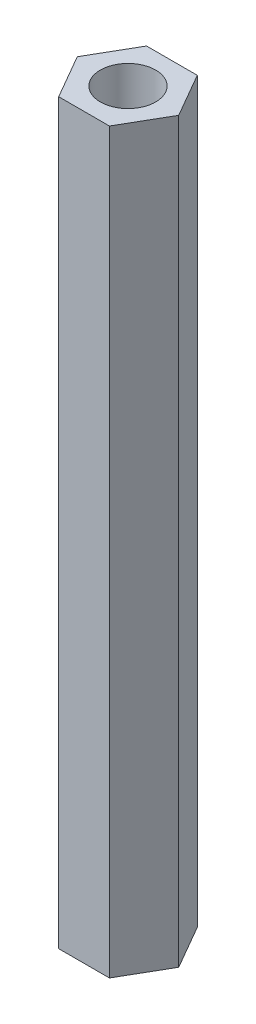
ISO-10303-21;
HEADER;
FILE_DESCRIPTION(('STEP AP214'),'2;1');
FILE_NAME('part.step','',(''),(''),'','','');
FILE_SCHEMA(('AUTOMOTIVE_DESIGN { 1 0 10303 214 1 1 1 1 }'));
ENDSEC;
DATA;
#1=APPLICATION_CONTEXT('core data for automotive mechanical design processes');
#2=APPLICATION_PROTOCOL_DEFINITION('international standard','automotive_design',2000,#1);
#3=PRODUCT_CONTEXT('',#1,'mechanical');
#4=PRODUCT('Part','Part','',(#3));
#5=PRODUCT_RELATED_PRODUCT_CATEGORY('part','',(#4));
#6=PRODUCT_DEFINITION_FORMATION('','',#4);
#7=PRODUCT_DEFINITION_CONTEXT('part definition',#1,'design');
#8=PRODUCT_DEFINITION('design','',#6,#7);
#9=PRODUCT_DEFINITION_SHAPE('','',#8);
#10=(LENGTH_UNIT() NAMED_UNIT(*) SI_UNIT(.MILLI.,.METRE.));
#11=(NAMED_UNIT(*) PLANE_ANGLE_UNIT() SI_UNIT($,.RADIAN.));
#12=(NAMED_UNIT(*) SI_UNIT($,.STERADIAN.) SOLID_ANGLE_UNIT());
#13=UNCERTAINTY_MEASURE_WITH_UNIT(LENGTH_MEASURE(1.E-05),#10,'distance_accuracy_value','');
#14=(GEOMETRIC_REPRESENTATION_CONTEXT(3) GLOBAL_UNCERTAINTY_ASSIGNED_CONTEXT((#13)) GLOBAL_UNIT_ASSIGNED_CONTEXT((#10,
#11,#12)) REPRESENTATION_CONTEXT('',''));
#15=CARTESIAN_POINT('',(0.,0.,0.));
#16=DIRECTION('',(0.,0.,1.));
#17=DIRECTION('',(1.,0.,0.));
#18=AXIS2_PLACEMENT_3D('',#15,#16,#17);
#19=CARTESIAN_POINT('',(0.,40.,0.));
#20=DIRECTION('',(0.,1.,0.));
#21=DIRECTION('',(0.,0.,1.));
#22=AXIS2_PLACEMENT_3D('',#19,#20,#21);
#23=PLANE('',#22);
#24=DIRECTION('',(0.499999999999995,0.,-0.866025403784441));
#25=VECTOR('',#24,1.);
#26=CARTESIAN_POINT('',(1.37500000000003,40.,2.38156986040719));
#27=LINE('',#26,#25);
#28=CARTESIAN_POINT('',(1.37500000000003,40.,2.38156986040719));
#29=VERTEX_POINT('',#28);
#30=CARTESIAN_POINT('',(2.75,40.,0.));
#31=VERTEX_POINT('',#30);
#32=EDGE_CURVE('E129',#29,#31,#27,.T.);
#33=ORIENTED_EDGE('',*,*,#32,.T.);
#34=DIRECTION('',(-0.500000000000001,0.,-0.866025403784438));
#35=VECTOR('',#34,1.);
#36=CARTESIAN_POINT('',(2.75,40.,0.));
#37=LINE('',#36,#35);
#38=CARTESIAN_POINT('',(1.37499999999999,40.,-2.38156986040721));
#39=VERTEX_POINT('',#38);
#40=EDGE_CURVE('E87',#31,#39,#37,.T.);
#41=ORIENTED_EDGE('',*,*,#40,.T.);
#42=DIRECTION('',(-1.,0.,0.));
#43=VECTOR('',#42,1.);
#44=CARTESIAN_POINT('',(1.37499999999999,40.,-2.38156986040721));
#45=LINE('',#44,#43);
#46=CARTESIAN_POINT('',(-1.37500000000001,40.,-2.3815698604072));
#47=VERTEX_POINT('',#46);
#48=EDGE_CURVE('E100',#39,#47,#45,.T.);
#49=ORIENTED_EDGE('',*,*,#48,.T.);
#50=DIRECTION('',(-0.499999999999995,0.,0.866025403784442));
#51=VECTOR('',#50,1.);
#52=CARTESIAN_POINT('',(-1.37500000000001,40.,-2.3815698604072));
#53=LINE('',#52,#51);
#54=CARTESIAN_POINT('',(-2.75,40.,0.));
#55=VERTEX_POINT('',#54);
#56=EDGE_CURVE('E94',#47,#55,#53,.T.);
#57=ORIENTED_EDGE('',*,*,#56,.T.);
#58=DIRECTION('',(0.500000000000007,0.,0.866025403784434));
#59=VECTOR('',#58,1.);
#60=CARTESIAN_POINT('',(-2.75,40.,0.));
#61=LINE('',#60,#59);
#62=CARTESIAN_POINT('',(-1.37499999999998,40.,2.38156986040722));
#63=VERTEX_POINT('',#62);
#64=EDGE_CURVE('E98',#55,#63,#61,.T.);
#65=ORIENTED_EDGE('',*,*,#64,.T.);
#66=DIRECTION('',(1.,0.,0.));
#67=VECTOR('',#66,1.);
#68=CARTESIAN_POINT('',(-1.37499999999998,40.,2.38156986040722));
#69=LINE('',#68,#67);
#70=EDGE_CURVE('E50',#63,#29,#69,.T.);
#71=ORIENTED_EDGE('',*,*,#70,.T.);
#72=EDGE_LOOP('',(#33,#41,#49,#57,#65,#71));
#73=FACE_BOUND('',#72,.T.);
#74=CARTESIAN_POINT('',(0.,40.,0.));
#75=DIRECTION('',(0.,1.,0.));
#76=DIRECTION('',(0.,0.,1.));
#77=AXIS2_PLACEMENT_3D('',#74,#75,#76);
#78=CIRCLE('',#77,1.5);
#79=CARTESIAN_POINT('',(0.,40.,1.5));
#80=VERTEX_POINT('',#79);
#81=EDGE_CURVE('E122',#80,#80,#78,.T.);
#82=ORIENTED_EDGE('',*,*,#81,.F.);
#83=EDGE_LOOP('',(#82));
#84=FACE_BOUND('',#83,.T.);
#85=ADVANCED_FACE('F33',(#73,#84),#23,.T.);
#86=CARTESIAN_POINT('',(0.,0.,0.));
#87=DIRECTION('',(0.,1.,0.));
#88=DIRECTION('',(0.,0.,1.));
#89=AXIS2_PLACEMENT_3D('',#86,#87,#88);
#90=PLANE('',#89);
#91=DIRECTION('',(0.499999999999995,0.,-0.866025403784441));
#92=VECTOR('',#91,1.);
#93=CARTESIAN_POINT('',(1.37500000000003,0.,2.38156986040719));
#94=LINE('',#93,#92);
#95=CARTESIAN_POINT('',(1.37500000000003,0.,2.38156986040719));
#96=VERTEX_POINT('',#95);
#97=CARTESIAN_POINT('',(2.75,0.,0.));
#98=VERTEX_POINT('',#97);
#99=EDGE_CURVE('E118',#96,#98,#94,.T.);
#100=ORIENTED_EDGE('',*,*,#99,.F.);
#101=DIRECTION('',(1.,0.,0.));
#102=VECTOR('',#101,1.);
#103=CARTESIAN_POINT('',(-1.37499999999998,0.,2.38156986040722));
#104=LINE('',#103,#102);
#105=CARTESIAN_POINT('',(-1.37499999999998,0.,2.38156986040722));
#106=VERTEX_POINT('',#105);
#107=EDGE_CURVE('E79',#106,#96,#104,.T.);
#108=ORIENTED_EDGE('',*,*,#107,.F.);
#109=DIRECTION('',(0.500000000000007,0.,0.866025403784434));
#110=VECTOR('',#109,1.);
#111=CARTESIAN_POINT('',(-2.75,0.,0.));
#112=LINE('',#111,#110);
#113=CARTESIAN_POINT('',(-2.75,0.,0.));
#114=VERTEX_POINT('',#113);
#115=EDGE_CURVE('E73',#114,#106,#112,.T.);
#116=ORIENTED_EDGE('',*,*,#115,.F.);
#117=DIRECTION('',(-0.499999999999995,0.,0.866025403784442));
#118=VECTOR('',#117,1.);
#119=CARTESIAN_POINT('',(-1.37500000000001,0.,-2.3815698604072));
#120=LINE('',#119,#118);
#121=CARTESIAN_POINT('',(-1.37500000000001,0.,-2.3815698604072));
#122=VERTEX_POINT('',#121);
#123=EDGE_CURVE('E108',#122,#114,#120,.T.);
#124=ORIENTED_EDGE('',*,*,#123,.F.);
#125=DIRECTION('',(-1.,0.,0.));
#126=VECTOR('',#125,1.);
#127=CARTESIAN_POINT('',(1.37499999999999,0.,-2.38156986040721));
#128=LINE('',#127,#126);
#129=CARTESIAN_POINT('',(1.37499999999999,0.,-2.38156986040721));
#130=VERTEX_POINT('',#129);
#131=EDGE_CURVE('E124',#130,#122,#128,.T.);
#132=ORIENTED_EDGE('',*,*,#131,.F.);
#133=DIRECTION('',(-0.500000000000001,0.,-0.866025403784438));
#134=VECTOR('',#133,1.);
#135=CARTESIAN_POINT('',(2.75,0.,0.));
#136=LINE('',#135,#134);
#137=EDGE_CURVE('E121',#98,#130,#136,.T.);
#138=ORIENTED_EDGE('',*,*,#137,.F.);
#139=EDGE_LOOP('',(#100,#108,#116,#124,#132,#138));
#140=FACE_BOUND('',#139,.T.);
#141=CARTESIAN_POINT('',(0.,0.,0.));
#142=DIRECTION('',(0.,1.,0.));
#143=DIRECTION('',(0.,0.,1.));
#144=AXIS2_PLACEMENT_3D('',#141,#142,#143);
#145=CIRCLE('',#144,1.5);
#146=CARTESIAN_POINT('',(0.,0.,1.5));
#147=VERTEX_POINT('',#146);
#148=EDGE_CURVE('E222',#147,#147,#145,.T.);
#149=ORIENTED_EDGE('',*,*,#148,.T.);
#150=EDGE_LOOP('',(#149));
#151=FACE_BOUND('',#150,.T.);
#152=ADVANCED_FACE('F138',(#140,#151),#90,.F.);
#153=CARTESIAN_POINT('',(1.37500000000003,40.,2.38156986040719));
#154=DIRECTION('',(-0.866025403784442,0.,-0.499999999999995));
#155=DIRECTION('',(-0.499999999999995,0.,0.866025403784442));
#156=AXIS2_PLACEMENT_3D('',#153,#154,#155);
#157=PLANE('',#156);
#158=ORIENTED_EDGE('',*,*,#99,.T.);
#159=DIRECTION('',(0.,-1.,0.));
#160=VECTOR('',#159,1.);
#161=CARTESIAN_POINT('',(2.75,40.,0.));
#162=LINE('',#161,#160);
#163=EDGE_CURVE('E11',#31,#98,#162,.T.);
#164=ORIENTED_EDGE('',*,*,#163,.F.);
#165=ORIENTED_EDGE('',*,*,#32,.F.);
#166=DIRECTION('',(0.,-1.,0.));
#167=VECTOR('',#166,1.);
#168=CARTESIAN_POINT('',(1.37500000000003,40.,2.38156986040719));
#169=LINE('',#168,#167);
#170=EDGE_CURVE('E114',#29,#96,#169,.T.);
#171=ORIENTED_EDGE('',*,*,#170,.T.);
#172=EDGE_LOOP('',(#158,#164,#165,#171));
#173=FACE_BOUND('',#172,.T.);
#174=ADVANCED_FACE('F35',(#173),#157,.F.);
#175=CARTESIAN_POINT('',(2.75,40.,0.));
#176=DIRECTION('',(-0.866025403784438,0.,0.500000000000001));
#177=DIRECTION('',(0.500000000000001,0.,0.866025403784438));
#178=AXIS2_PLACEMENT_3D('',#175,#176,#177);
#179=PLANE('',#178);
#180=ORIENTED_EDGE('',*,*,#137,.T.);
#181=DIRECTION('',(0.,-1.,0.));
#182=VECTOR('',#181,1.);
#183=CARTESIAN_POINT('',(1.37499999999999,40.,-2.38156986040721));
#184=LINE('',#183,#182);
#185=EDGE_CURVE('E42',#39,#130,#184,.T.);
#186=ORIENTED_EDGE('',*,*,#185,.F.);
#187=ORIENTED_EDGE('',*,*,#40,.F.);
#188=ORIENTED_EDGE('',*,*,#163,.T.);
#189=EDGE_LOOP('',(#180,#186,#187,#188));
#190=FACE_BOUND('',#189,.T.);
#191=ADVANCED_FACE('F163',(#190),#179,.F.);
#192=CARTESIAN_POINT('',(1.37499999999999,40.,-2.38156986040721));
#193=DIRECTION('',(0.,0.,1.));
#194=DIRECTION('',(1.,0.,0.));
#195=AXIS2_PLACEMENT_3D('',#192,#193,#194);
#196=PLANE('',#195);
#197=ORIENTED_EDGE('',*,*,#131,.T.);
#198=DIRECTION('',(0.,-1.,0.));
#199=VECTOR('',#198,1.);
#200=CARTESIAN_POINT('',(-1.37500000000001,40.,-2.3815698604072));
#201=LINE('',#200,#199);
#202=EDGE_CURVE('E109',#47,#122,#201,.T.);
#203=ORIENTED_EDGE('',*,*,#202,.F.);
#204=ORIENTED_EDGE('',*,*,#48,.F.);
#205=ORIENTED_EDGE('',*,*,#185,.T.);
#206=EDGE_LOOP('',(#197,#203,#204,#205));
#207=FACE_BOUND('',#206,.T.);
#208=ADVANCED_FACE('F135',(#207),#196,.F.);
#209=CARTESIAN_POINT('',(-1.37500000000001,40.,-2.3815698604072));
#210=DIRECTION('',(0.866025403784442,0.,0.499999999999995));
#211=DIRECTION('',(0.499999999999995,0.,-0.866025403784442));
#212=AXIS2_PLACEMENT_3D('',#209,#210,#211);
#213=PLANE('',#212);
#214=ORIENTED_EDGE('',*,*,#123,.T.);
#215=DIRECTION('',(0.,-1.,0.));
#216=VECTOR('',#215,1.);
#217=CARTESIAN_POINT('',(-2.75,40.,0.));
#218=LINE('',#217,#216);
#219=EDGE_CURVE('E105',#55,#114,#218,.T.);
#220=ORIENTED_EDGE('',*,*,#219,.F.);
#221=ORIENTED_EDGE('',*,*,#56,.F.);
#222=ORIENTED_EDGE('',*,*,#202,.T.);
#223=EDGE_LOOP('',(#214,#220,#221,#222));
#224=FACE_BOUND('',#223,.T.);
#225=ADVANCED_FACE('F106',(#224),#213,.F.);
#226=CARTESIAN_POINT('',(-2.75,40.,0.));
#227=DIRECTION('',(0.866025403784435,0.,-0.500000000000007));
#228=DIRECTION('',(-0.500000000000007,0.,-0.866025403784435));
#229=AXIS2_PLACEMENT_3D('',#226,#227,#228);
#230=PLANE('',#229);
#231=ORIENTED_EDGE('',*,*,#115,.T.);
#232=DIRECTION('',(0.,-1.,0.));
#233=VECTOR('',#232,1.);
#234=CARTESIAN_POINT('',(-1.37499999999998,40.,2.38156986040722));
#235=LINE('',#234,#233);
#236=EDGE_CURVE('E110',#63,#106,#235,.T.);
#237=ORIENTED_EDGE('',*,*,#236,.F.);
#238=ORIENTED_EDGE('',*,*,#64,.F.);
#239=ORIENTED_EDGE('',*,*,#219,.T.);
#240=EDGE_LOOP('',(#231,#237,#238,#239));
#241=FACE_BOUND('',#240,.T.);
#242=ADVANCED_FACE('F112',(#241),#230,.F.);
#243=CARTESIAN_POINT('',(-1.37499999999998,40.,2.38156986040722));
#244=DIRECTION('',(0.,0.,-1.));
#245=DIRECTION('',(-1.,0.,0.));
#246=AXIS2_PLACEMENT_3D('',#243,#244,#245);
#247=PLANE('',#246);
#248=ORIENTED_EDGE('',*,*,#107,.T.);
#249=ORIENTED_EDGE('',*,*,#170,.F.);
#250=ORIENTED_EDGE('',*,*,#70,.F.);
#251=ORIENTED_EDGE('',*,*,#236,.T.);
#252=EDGE_LOOP('',(#248,#249,#250,#251));
#253=FACE_BOUND('',#252,.T.);
#254=ADVANCED_FACE('F143',(#253),#247,.F.);
#255=CARTESIAN_POINT('',(0.,40.,0.));
#256=DIRECTION('',(0.,-1.,0.));
#257=DIRECTION('',(0.,0.,-1.));
#258=AXIS2_PLACEMENT_3D('',#255,#256,#257);
#259=CYLINDRICAL_SURFACE('',#258,1.5);
#260=ORIENTED_EDGE('',*,*,#81,.T.);
#261=EDGE_LOOP('',(#260));
#262=FACE_BOUND('',#261,.T.);
#263=ORIENTED_EDGE('',*,*,#148,.F.);
#264=EDGE_LOOP('',(#263));
#265=FACE_BOUND('',#264,.T.);
#266=ADVANCED_FACE('F145',(#262,#265),#259,.F.);
#267=CLOSED_SHELL('',(#85,#152,#174,#191,#208,#225,#242,#254,#266));
#268=MANIFOLD_SOLID_BREP('B2',#267);
#269=ADVANCED_BREP_SHAPE_REPRESENTATION('',(#18,#268),#14);
#270=SHAPE_DEFINITION_REPRESENTATION(#9,#269);
ENDSEC;
END-ISO-10303-21;
